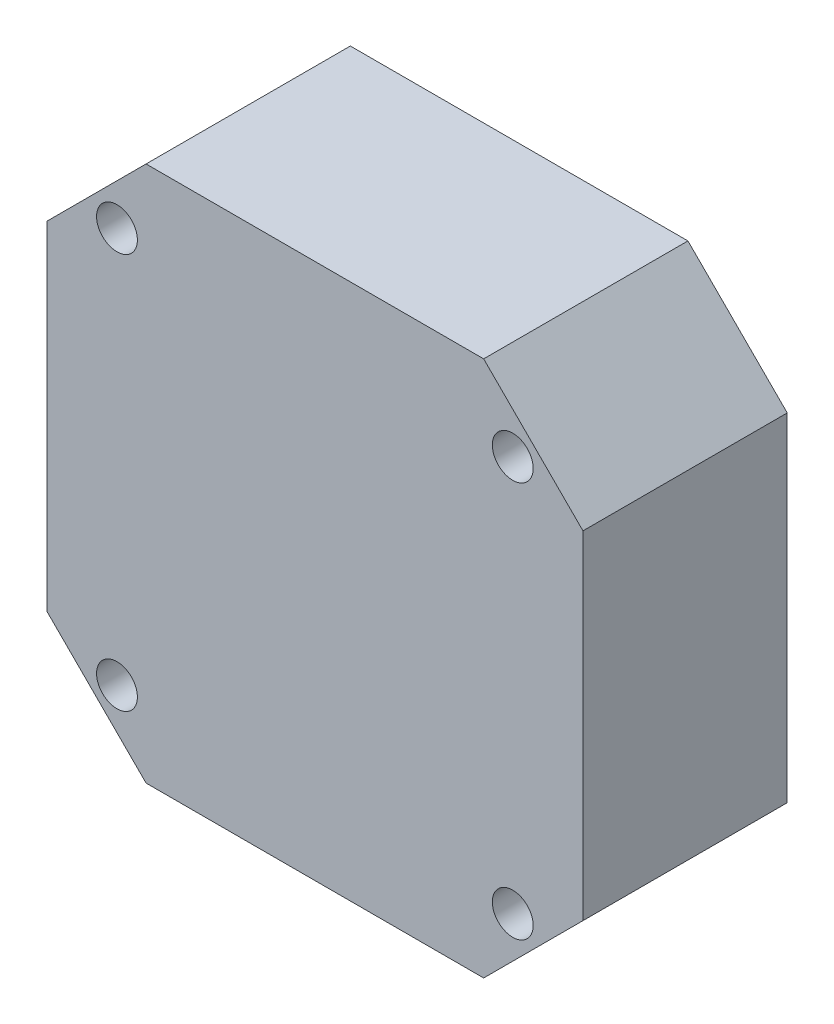
ISO-10303-21;
HEADER;
FILE_DESCRIPTION(('STEP AP214'),'2;1');
FILE_NAME('part.step','',(''),(''),'','','');
FILE_SCHEMA(('AUTOMOTIVE_DESIGN { 1 0 10303 214 1 1 1 1 }'));
ENDSEC;
DATA;
#1=APPLICATION_CONTEXT('core data for automotive mechanical design processes');
#2=APPLICATION_PROTOCOL_DEFINITION('international standard','automotive_design',2000,#1);
#3=PRODUCT_CONTEXT('',#1,'mechanical');
#4=PRODUCT('Part','Part','',(#3));
#5=PRODUCT_RELATED_PRODUCT_CATEGORY('part','',(#4));
#6=PRODUCT_DEFINITION_FORMATION('','',#4);
#7=PRODUCT_DEFINITION_CONTEXT('part definition',#1,'design');
#8=PRODUCT_DEFINITION('design','',#6,#7);
#9=PRODUCT_DEFINITION_SHAPE('','',#8);
#10=(LENGTH_UNIT() NAMED_UNIT(*) SI_UNIT(.MILLI.,.METRE.));
#11=(NAMED_UNIT(*) PLANE_ANGLE_UNIT() SI_UNIT($,.RADIAN.));
#12=(NAMED_UNIT(*) SI_UNIT($,.STERADIAN.) SOLID_ANGLE_UNIT());
#13=UNCERTAINTY_MEASURE_WITH_UNIT(LENGTH_MEASURE(1.E-05),#10,'distance_accuracy_value','');
#14=(GEOMETRIC_REPRESENTATION_CONTEXT(3) GLOBAL_UNCERTAINTY_ASSIGNED_CONTEXT((#13)) GLOBAL_UNIT_ASSIGNED_CONTEXT((#10,
#11,#12)) REPRESENTATION_CONTEXT('',''));
#15=CARTESIAN_POINT('',(0.,0.,0.));
#16=DIRECTION('',(0.,0.,1.));
#17=DIRECTION('',(1.,0.,0.));
#18=AXIS2_PLACEMENT_3D('',#15,#16,#17);
#19=CARTESIAN_POINT('',(21.,-13.221825406948,16.));
#20=DIRECTION('',(-0.707106781186548,0.707106781186548,0.));
#21=DIRECTION('',(0.,0.,-1.));
#22=AXIS2_PLACEMENT_3D('',#19,#20,#21);
#23=PLANE('',#22);
#24=DIRECTION('',(0.,0.,-1.));
#25=VECTOR('',#24,1.);
#26=CARTESIAN_POINT('',(21.,-13.221825406948,16.));
#27=LINE('',#26,#25);
#28=CARTESIAN_POINT('',(21.,-13.221825406948,16.));
#29=VERTEX_POINT('',#28);
#30=CARTESIAN_POINT('',(21.,-13.221825406948,0.));
#31=VERTEX_POINT('',#30);
#32=EDGE_CURVE('E174',#29,#31,#27,.T.);
#33=ORIENTED_EDGE('',*,*,#32,.F.);
#34=DIRECTION('',(-0.707106781186548,-0.707106781186548,0.));
#35=VECTOR('',#34,1.);
#36=CARTESIAN_POINT('',(21.,-13.221825406948,16.));
#37=LINE('',#36,#35);
#38=CARTESIAN_POINT('',(13.221825406948,-21.,16.));
#39=VERTEX_POINT('',#38);
#40=EDGE_CURVE('E56',#39,#29,#37,.F.);
#41=ORIENTED_EDGE('',*,*,#40,.F.);
#42=DIRECTION('',(0.,0.,1.));
#43=VECTOR('',#42,1.);
#44=CARTESIAN_POINT('',(13.221825406948,-21.,16.));
#45=LINE('',#44,#43);
#46=CARTESIAN_POINT('',(13.221825406948,-21.,0.));
#47=VERTEX_POINT('',#46);
#48=EDGE_CURVE('E173',#47,#39,#45,.T.);
#49=ORIENTED_EDGE('',*,*,#48,.F.);
#50=DIRECTION('',(0.707106781186548,0.707106781186548,0.));
#51=VECTOR('',#50,1.);
#52=CARTESIAN_POINT('',(17.110912703474,-17.110912703474,0.));
#53=LINE('',#52,#51);
#54=EDGE_CURVE('E13',#31,#47,#53,.F.);
#55=ORIENTED_EDGE('',*,*,#54,.F.);
#56=EDGE_LOOP('',(#33,#41,#49,#55));
#57=FACE_BOUND('',#56,.T.);
#58=ADVANCED_FACE('F51',(#57),#23,.F.);
#59=CARTESIAN_POINT('',(-13.221825406948,-21.,16.));
#60=DIRECTION('',(0.707106781186548,0.707106781186548,0.));
#61=DIRECTION('',(0.,0.,-1.));
#62=AXIS2_PLACEMENT_3D('',#59,#60,#61);
#63=PLANE('',#62);
#64=DIRECTION('',(0.,0.,-1.));
#65=VECTOR('',#64,1.);
#66=CARTESIAN_POINT('',(-13.221825406948,-21.,16.));
#67=LINE('',#66,#65);
#68=CARTESIAN_POINT('',(-13.221825406948,-21.,16.));
#69=VERTEX_POINT('',#68);
#70=CARTESIAN_POINT('',(-13.221825406948,-21.,0.));
#71=VERTEX_POINT('',#70);
#72=EDGE_CURVE('E165',#69,#71,#67,.T.);
#73=ORIENTED_EDGE('',*,*,#72,.F.);
#74=DIRECTION('',(-0.707106781186548,0.707106781186548,0.));
#75=VECTOR('',#74,1.);
#76=CARTESIAN_POINT('',(-13.221825406948,-21.,16.));
#77=LINE('',#76,#75);
#78=CARTESIAN_POINT('',(-21.,-13.221825406948,16.));
#79=VERTEX_POINT('',#78);
#80=EDGE_CURVE('E169',#79,#69,#77,.F.);
#81=ORIENTED_EDGE('',*,*,#80,.F.);
#82=DIRECTION('',(0.,0.,1.));
#83=VECTOR('',#82,1.);
#84=CARTESIAN_POINT('',(-21.,-13.221825406948,16.));
#85=LINE('',#84,#83);
#86=CARTESIAN_POINT('',(-21.,-13.221825406948,0.));
#87=VERTEX_POINT('',#86);
#88=EDGE_CURVE('E164',#87,#79,#85,.T.);
#89=ORIENTED_EDGE('',*,*,#88,.F.);
#90=DIRECTION('',(0.707106781186548,-0.707106781186548,0.));
#91=VECTOR('',#90,1.);
#92=CARTESIAN_POINT('',(-17.110912703474,-17.110912703474,0.));
#93=LINE('',#92,#91);
#94=EDGE_CURVE('E168',#71,#87,#93,.F.);
#95=ORIENTED_EDGE('',*,*,#94,.F.);
#96=EDGE_LOOP('',(#73,#81,#89,#95));
#97=FACE_BOUND('',#96,.T.);
#98=ADVANCED_FACE('F196',(#97),#63,.F.);
#99=CARTESIAN_POINT('',(-21.,13.221825406948,16.));
#100=DIRECTION('',(0.707106781186548,-0.707106781186548,0.));
#101=DIRECTION('',(0.,0.,-1.));
#102=AXIS2_PLACEMENT_3D('',#99,#100,#101);
#103=PLANE('',#102);
#104=DIRECTION('',(0.,0.,-1.));
#105=VECTOR('',#104,1.);
#106=CARTESIAN_POINT('',(-21.,13.221825406948,16.));
#107=LINE('',#106,#105);
#108=CARTESIAN_POINT('',(-21.,13.221825406948,16.));
#109=VERTEX_POINT('',#108);
#110=CARTESIAN_POINT('',(-21.,13.221825406948,0.));
#111=VERTEX_POINT('',#110);
#112=EDGE_CURVE('E121',#109,#111,#107,.T.);
#113=ORIENTED_EDGE('',*,*,#112,.F.);
#114=DIRECTION('',(0.707106781186548,0.707106781186548,0.));
#115=VECTOR('',#114,1.);
#116=CARTESIAN_POINT('',(-21.,13.221825406948,16.));
#117=LINE('',#116,#115);
#118=CARTESIAN_POINT('',(-13.221825406948,21.,16.));
#119=VERTEX_POINT('',#118);
#120=EDGE_CURVE('E157',#119,#109,#117,.F.);
#121=ORIENTED_EDGE('',*,*,#120,.F.);
#122=DIRECTION('',(0.,0.,1.));
#123=VECTOR('',#122,1.);
#124=CARTESIAN_POINT('',(-13.221825406948,21.,16.));
#125=LINE('',#124,#123);
#126=CARTESIAN_POINT('',(-13.221825406948,21.,0.));
#127=VERTEX_POINT('',#126);
#128=EDGE_CURVE('E160',#127,#119,#125,.T.);
#129=ORIENTED_EDGE('',*,*,#128,.F.);
#130=DIRECTION('',(-0.707106781186548,-0.707106781186548,0.));
#131=VECTOR('',#130,1.);
#132=CARTESIAN_POINT('',(-17.110912703474,17.110912703474,0.));
#133=LINE('',#132,#131);
#134=EDGE_CURVE('E140',#111,#127,#133,.F.);
#135=ORIENTED_EDGE('',*,*,#134,.F.);
#136=EDGE_LOOP('',(#113,#121,#129,#135));
#137=FACE_BOUND('',#136,.T.);
#138=ADVANCED_FACE('F216',(#137),#103,.F.);
#139=CARTESIAN_POINT('',(13.221825406948,21.,16.));
#140=DIRECTION('',(-0.707106781186548,-0.707106781186548,0.));
#141=DIRECTION('',(0.,0.,-1.));
#142=AXIS2_PLACEMENT_3D('',#139,#140,#141);
#143=PLANE('',#142);
#144=DIRECTION('',(0.,0.,-1.));
#145=VECTOR('',#144,1.);
#146=CARTESIAN_POINT('',(13.221825406948,21.,16.));
#147=LINE('',#146,#145);
#148=CARTESIAN_POINT('',(13.221825406948,21.,16.));
#149=VERTEX_POINT('',#148);
#150=CARTESIAN_POINT('',(13.221825406948,21.,0.));
#151=VERTEX_POINT('',#150);
#152=EDGE_CURVE('E116',#149,#151,#147,.T.);
#153=ORIENTED_EDGE('',*,*,#152,.F.);
#154=DIRECTION('',(0.707106781186548,-0.707106781186548,0.));
#155=VECTOR('',#154,1.);
#156=CARTESIAN_POINT('',(13.221825406948,21.,16.));
#157=LINE('',#156,#155);
#158=CARTESIAN_POINT('',(21.,13.221825406948,16.));
#159=VERTEX_POINT('',#158);
#160=EDGE_CURVE('E123',#159,#149,#157,.F.);
#161=ORIENTED_EDGE('',*,*,#160,.F.);
#162=DIRECTION('',(0.,0.,1.));
#163=VECTOR('',#162,1.);
#164=CARTESIAN_POINT('',(21.,13.221825406948,16.));
#165=LINE('',#164,#163);
#166=CARTESIAN_POINT('',(21.,13.221825406948,0.));
#167=VERTEX_POINT('',#166);
#168=EDGE_CURVE('E124',#167,#159,#165,.T.);
#169=ORIENTED_EDGE('',*,*,#168,.F.);
#170=DIRECTION('',(-0.707106781186548,0.707106781186548,0.));
#171=VECTOR('',#170,1.);
#172=CARTESIAN_POINT('',(17.110912703474,17.110912703474,0.));
#173=LINE('',#172,#171);
#174=EDGE_CURVE('E113',#151,#167,#173,.F.);
#175=ORIENTED_EDGE('',*,*,#174,.F.);
#176=EDGE_LOOP('',(#153,#161,#169,#175));
#177=FACE_BOUND('',#176,.T.);
#178=ADVANCED_FACE('F119',(#177),#143,.F.);
#179=CARTESIAN_POINT('',(21.,-21.,16.));
#180=DIRECTION('',(-1.,0.,0.));
#181=DIRECTION('',(0.,0.,1.));
#182=AXIS2_PLACEMENT_3D('',#179,#180,#181);
#183=PLANE('',#182);
#184=DIRECTION('',(0.,1.,0.));
#185=VECTOR('',#184,1.);
#186=CARTESIAN_POINT('',(21.,-21.,16.));
#187=LINE('',#186,#185);
#188=EDGE_CURVE('E151',#29,#159,#187,.T.);
#189=ORIENTED_EDGE('',*,*,#188,.F.);
#190=ORIENTED_EDGE('',*,*,#32,.T.);
#191=DIRECTION('',(0.,1.,0.));
#192=VECTOR('',#191,1.);
#193=CARTESIAN_POINT('',(21.,-21.,0.));
#194=LINE('',#193,#192);
#195=EDGE_CURVE('E143',#31,#167,#194,.T.);
#196=ORIENTED_EDGE('',*,*,#195,.T.);
#197=ORIENTED_EDGE('',*,*,#168,.T.);
#198=EDGE_LOOP('',(#189,#190,#196,#197));
#199=FACE_BOUND('',#198,.T.);
#200=ADVANCED_FACE('F185',(#199),#183,.F.);
#201=CARTESIAN_POINT('',(-21.,21.,16.));
#202=DIRECTION('',(0.,-1.,0.));
#203=DIRECTION('',(0.,0.,-1.));
#204=AXIS2_PLACEMENT_3D('',#201,#202,#203);
#205=PLANE('',#204);
#206=DIRECTION('',(-1.,0.,0.));
#207=VECTOR('',#206,1.);
#208=CARTESIAN_POINT('',(-21.,21.,0.));
#209=LINE('',#208,#207);
#210=EDGE_CURVE('E132',#151,#127,#209,.T.);
#211=ORIENTED_EDGE('',*,*,#210,.T.);
#212=ORIENTED_EDGE('',*,*,#128,.T.);
#213=DIRECTION('',(-1.,0.,0.));
#214=VECTOR('',#213,1.);
#215=CARTESIAN_POINT('',(-21.,21.,16.));
#216=LINE('',#215,#214);
#217=EDGE_CURVE('E135',#149,#119,#216,.T.);
#218=ORIENTED_EDGE('',*,*,#217,.F.);
#219=ORIENTED_EDGE('',*,*,#152,.T.);
#220=EDGE_LOOP('',(#211,#212,#218,#219));
#221=FACE_BOUND('',#220,.T.);
#222=ADVANCED_FACE('F129',(#221),#205,.F.);
#223=CARTESIAN_POINT('',(-21.,-21.,16.));
#224=DIRECTION('',(1.,0.,0.));
#225=DIRECTION('',(0.,0.,-1.));
#226=AXIS2_PLACEMENT_3D('',#223,#224,#225);
#227=PLANE('',#226);
#228=DIRECTION('',(0.,-1.,0.));
#229=VECTOR('',#228,1.);
#230=CARTESIAN_POINT('',(-21.,-21.,0.));
#231=LINE('',#230,#229);
#232=EDGE_CURVE('E138',#111,#87,#231,.T.);
#233=ORIENTED_EDGE('',*,*,#232,.T.);
#234=ORIENTED_EDGE('',*,*,#88,.T.);
#235=DIRECTION('',(0.,-1.,0.));
#236=VECTOR('',#235,1.);
#237=CARTESIAN_POINT('',(-21.,-21.,16.));
#238=LINE('',#237,#236);
#239=EDGE_CURVE('E184',#109,#79,#238,.T.);
#240=ORIENTED_EDGE('',*,*,#239,.F.);
#241=ORIENTED_EDGE('',*,*,#112,.T.);
#242=EDGE_LOOP('',(#233,#234,#240,#241));
#243=FACE_BOUND('',#242,.T.);
#244=ADVANCED_FACE('F193',(#243),#227,.F.);
#245=CARTESIAN_POINT('',(-21.,-21.,16.));
#246=DIRECTION('',(0.,1.,0.));
#247=DIRECTION('',(0.,0.,1.));
#248=AXIS2_PLACEMENT_3D('',#245,#246,#247);
#249=PLANE('',#248);
#250=DIRECTION('',(1.,0.,0.));
#251=VECTOR('',#250,1.);
#252=CARTESIAN_POINT('',(-21.,-21.,0.));
#253=LINE('',#252,#251);
#254=EDGE_CURVE('E145',#71,#47,#253,.T.);
#255=ORIENTED_EDGE('',*,*,#254,.T.);
#256=ORIENTED_EDGE('',*,*,#48,.T.);
#257=DIRECTION('',(1.,0.,0.));
#258=VECTOR('',#257,1.);
#259=CARTESIAN_POINT('',(-21.,-21.,16.));
#260=LINE('',#259,#258);
#261=EDGE_CURVE('E131',#69,#39,#260,.T.);
#262=ORIENTED_EDGE('',*,*,#261,.F.);
#263=ORIENTED_EDGE('',*,*,#72,.T.);
#264=EDGE_LOOP('',(#255,#256,#262,#263));
#265=FACE_BOUND('',#264,.T.);
#266=ADVANCED_FACE('F199',(#265),#249,.F.);
#267=CARTESIAN_POINT('',(0.,0.,16.));
#268=DIRECTION('',(0.,0.,-1.));
#269=DIRECTION('',(-1.,0.,0.));
#270=AXIS2_PLACEMENT_3D('',#267,#268,#269);
#271=PLANE('',#270);
#272=CARTESIAN_POINT('',(-15.4999999999999,15.5,16.));
#273=DIRECTION('',(0.,0.,-1.));
#274=DIRECTION('',(-1.,0.,0.));
#275=AXIS2_PLACEMENT_3D('',#272,#273,#274);
#276=CIRCLE('',#275,1.60000000000019);
#277=CARTESIAN_POINT('',(-17.1000000000001,15.5,16.));
#278=VERTEX_POINT('',#277);
#279=EDGE_CURVE('E333',#278,#278,#276,.T.);
#280=ORIENTED_EDGE('',*,*,#279,.T.);
#281=EDGE_LOOP('',(#280));
#282=FACE_BOUND('',#281,.T.);
#283=CARTESIAN_POINT('',(15.5000000000001,-15.5,16.));
#284=DIRECTION('',(0.,0.,-1.));
#285=DIRECTION('',(-1.,0.,0.));
#286=AXIS2_PLACEMENT_3D('',#283,#284,#285);
#287=CIRCLE('',#286,1.60000000000019);
#288=CARTESIAN_POINT('',(13.8999999999999,-15.5,16.));
#289=VERTEX_POINT('',#288);
#290=EDGE_CURVE('E349',#289,#289,#287,.T.);
#291=ORIENTED_EDGE('',*,*,#290,.T.);
#292=EDGE_LOOP('',(#291));
#293=FACE_BOUND('',#292,.T.);
#294=CARTESIAN_POINT('',(-15.4999999999999,-15.5,16.));
#295=DIRECTION('',(0.,0.,-1.));
#296=DIRECTION('',(-1.,0.,0.));
#297=AXIS2_PLACEMENT_3D('',#294,#295,#296);
#298=CIRCLE('',#297,1.60000000000019);
#299=CARTESIAN_POINT('',(-17.1000000000001,-15.5,16.));
#300=VERTEX_POINT('',#299);
#301=EDGE_CURVE('E341',#300,#300,#298,.T.);
#302=ORIENTED_EDGE('',*,*,#301,.T.);
#303=EDGE_LOOP('',(#302));
#304=FACE_BOUND('',#303,.T.);
#305=CARTESIAN_POINT('',(15.5000000000001,15.5,16.));
#306=DIRECTION('',(0.,0.,-1.));
#307=DIRECTION('',(-1.,0.,0.));
#308=AXIS2_PLACEMENT_3D('',#305,#306,#307);
#309=CIRCLE('',#308,1.6000000000002);
#310=CARTESIAN_POINT('',(13.8999999999999,15.5,16.));
#311=VERTEX_POINT('',#310);
#312=EDGE_CURVE('E148',#311,#311,#309,.T.);
#313=ORIENTED_EDGE('',*,*,#312,.T.);
#314=EDGE_LOOP('',(#313));
#315=FACE_BOUND('',#314,.T.);
#316=ORIENTED_EDGE('',*,*,#261,.T.);
#317=ORIENTED_EDGE('',*,*,#40,.T.);
#318=ORIENTED_EDGE('',*,*,#188,.T.);
#319=ORIENTED_EDGE('',*,*,#160,.T.);
#320=ORIENTED_EDGE('',*,*,#217,.T.);
#321=ORIENTED_EDGE('',*,*,#120,.T.);
#322=ORIENTED_EDGE('',*,*,#239,.T.);
#323=ORIENTED_EDGE('',*,*,#80,.T.);
#324=EDGE_LOOP('',(#316,#317,#318,#319,#320,#321,#322,#323));
#325=FACE_BOUND('',#324,.T.);
#326=ADVANCED_FACE('F180',(#282,#293,#304,#315,#325),#271,.F.);
#327=CARTESIAN_POINT('',(0.,0.,0.));
#328=DIRECTION('',(0.,0.,-1.));
#329=DIRECTION('',(-1.,0.,0.));
#330=AXIS2_PLACEMENT_3D('',#327,#328,#329);
#331=PLANE('',#330);
#332=CARTESIAN_POINT('',(-15.4999999999999,15.5,0.));
#333=DIRECTION('',(0.,0.,-1.));
#334=DIRECTION('',(-1.,0.,0.));
#335=AXIS2_PLACEMENT_3D('',#332,#333,#334);
#336=CIRCLE('',#335,1.60000000000019);
#337=CARTESIAN_POINT('',(-17.1000000000001,15.5,0.));
#338=VERTEX_POINT('',#337);
#339=EDGE_CURVE('E340',#338,#338,#336,.T.);
#340=ORIENTED_EDGE('',*,*,#339,.F.);
#341=EDGE_LOOP('',(#340));
#342=FACE_BOUND('',#341,.T.);
#343=CARTESIAN_POINT('',(15.5000000000001,-15.5,0.));
#344=DIRECTION('',(0.,0.,-1.));
#345=DIRECTION('',(-1.,0.,0.));
#346=AXIS2_PLACEMENT_3D('',#343,#344,#345);
#347=CIRCLE('',#346,1.60000000000019);
#348=CARTESIAN_POINT('',(13.8999999999999,-15.5,0.));
#349=VERTEX_POINT('',#348);
#350=EDGE_CURVE('E342',#349,#349,#347,.T.);
#351=ORIENTED_EDGE('',*,*,#350,.F.);
#352=EDGE_LOOP('',(#351));
#353=FACE_BOUND('',#352,.T.);
#354=CARTESIAN_POINT('',(-15.4999999999999,-15.5,0.));
#355=DIRECTION('',(0.,0.,-1.));
#356=DIRECTION('',(-1.,0.,0.));
#357=AXIS2_PLACEMENT_3D('',#354,#355,#356);
#358=CIRCLE('',#357,1.60000000000019);
#359=CARTESIAN_POINT('',(-17.1000000000001,-15.5,0.));
#360=VERTEX_POINT('',#359);
#361=EDGE_CURVE('E352',#360,#360,#358,.T.);
#362=ORIENTED_EDGE('',*,*,#361,.F.);
#363=EDGE_LOOP('',(#362));
#364=FACE_BOUND('',#363,.T.);
#365=CARTESIAN_POINT('',(15.5000000000001,15.5,0.));
#366=DIRECTION('',(0.,0.,-1.));
#367=DIRECTION('',(-1.,0.,0.));
#368=AXIS2_PLACEMENT_3D('',#365,#366,#367);
#369=CIRCLE('',#368,1.6000000000002);
#370=CARTESIAN_POINT('',(13.8999999999999,15.5,0.));
#371=VERTEX_POINT('',#370);
#372=EDGE_CURVE('E189',#371,#371,#369,.T.);
#373=ORIENTED_EDGE('',*,*,#372,.F.);
#374=EDGE_LOOP('',(#373));
#375=FACE_BOUND('',#374,.T.);
#376=ORIENTED_EDGE('',*,*,#195,.F.);
#377=ORIENTED_EDGE('',*,*,#54,.T.);
#378=ORIENTED_EDGE('',*,*,#254,.F.);
#379=ORIENTED_EDGE('',*,*,#94,.T.);
#380=ORIENTED_EDGE('',*,*,#232,.F.);
#381=ORIENTED_EDGE('',*,*,#134,.T.);
#382=ORIENTED_EDGE('',*,*,#210,.F.);
#383=ORIENTED_EDGE('',*,*,#174,.T.);
#384=EDGE_LOOP('',(#376,#377,#378,#379,#380,#381,#382,#383));
#385=FACE_BOUND('',#384,.T.);
#386=ADVANCED_FACE('F137',(#342,#353,#364,#375,#385),#331,.T.);
#387=CARTESIAN_POINT('',(15.5000000000001,15.5,16.));
#388=DIRECTION('',(0.,0.,-1.));
#389=DIRECTION('',(-1.,0.,0.));
#390=AXIS2_PLACEMENT_3D('',#387,#388,#389);
#391=CYLINDRICAL_SURFACE('',#390,1.6000000000002);
#392=ORIENTED_EDGE('',*,*,#312,.F.);
#393=EDGE_LOOP('',(#392));
#394=FACE_BOUND('',#393,.T.);
#395=ORIENTED_EDGE('',*,*,#372,.T.);
#396=EDGE_LOOP('',(#395));
#397=FACE_BOUND('',#396,.T.);
#398=ADVANCED_FACE('F257',(#394,#397),#391,.F.);
#399=CARTESIAN_POINT('',(-15.4999999999999,-15.5,16.));
#400=DIRECTION('',(0.,0.,-1.));
#401=DIRECTION('',(-1.,0.,0.));
#402=AXIS2_PLACEMENT_3D('',#399,#400,#401);
#403=CYLINDRICAL_SURFACE('',#402,1.60000000000019);
#404=ORIENTED_EDGE('',*,*,#301,.F.);
#405=EDGE_LOOP('',(#404));
#406=FACE_BOUND('',#405,.T.);
#407=ORIENTED_EDGE('',*,*,#361,.T.);
#408=EDGE_LOOP('',(#407));
#409=FACE_BOUND('',#408,.T.);
#410=ADVANCED_FACE('F290',(#406,#409),#403,.F.);
#411=CARTESIAN_POINT('',(15.5000000000001,-15.5,16.));
#412=DIRECTION('',(0.,0.,-1.));
#413=DIRECTION('',(-1.,0.,0.));
#414=AXIS2_PLACEMENT_3D('',#411,#412,#413);
#415=CYLINDRICAL_SURFACE('',#414,1.60000000000019);
#416=ORIENTED_EDGE('',*,*,#290,.F.);
#417=EDGE_LOOP('',(#416));
#418=FACE_BOUND('',#417,.T.);
#419=ORIENTED_EDGE('',*,*,#350,.T.);
#420=EDGE_LOOP('',(#419));
#421=FACE_BOUND('',#420,.T.);
#422=ADVANCED_FACE('F299',(#418,#421),#415,.F.);
#423=CARTESIAN_POINT('',(-15.4999999999999,15.5,16.));
#424=DIRECTION('',(0.,0.,-1.));
#425=DIRECTION('',(-1.,0.,0.));
#426=AXIS2_PLACEMENT_3D('',#423,#424,#425);
#427=CYLINDRICAL_SURFACE('',#426,1.60000000000019);
#428=ORIENTED_EDGE('',*,*,#279,.F.);
#429=EDGE_LOOP('',(#428));
#430=FACE_BOUND('',#429,.T.);
#431=ORIENTED_EDGE('',*,*,#339,.T.);
#432=EDGE_LOOP('',(#431));
#433=FACE_BOUND('',#432,.T.);
#434=ADVANCED_FACE('F308',(#430,#433),#427,.F.);
#435=CLOSED_SHELL('',(#58,#98,#138,#178,#200,#222,#244,#266,#326,#386,#398,#410,#422,#434));
#436=MANIFOLD_SOLID_BREP('B2',#435);
#437=ADVANCED_BREP_SHAPE_REPRESENTATION('',(#18,#436),#14);
#438=SHAPE_DEFINITION_REPRESENTATION(#9,#437);
ENDSEC;
END-ISO-10303-21;
